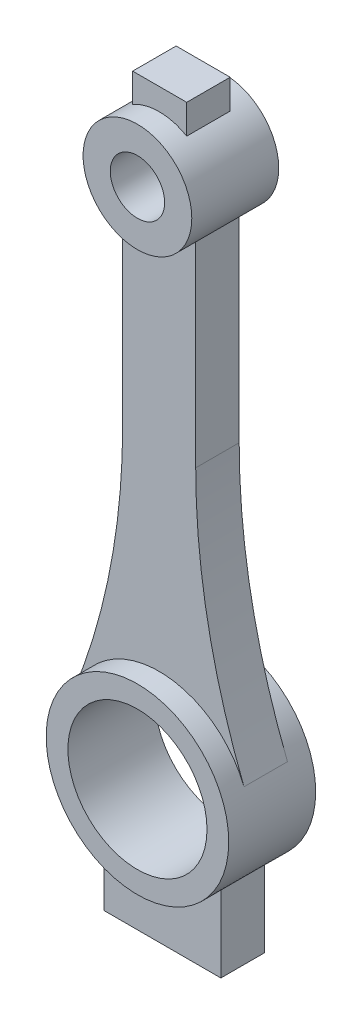
ISO-10303-21;
HEADER;
FILE_DESCRIPTION(('STEP AP214'),'2;1');
FILE_NAME('part.step','',(''),(''),'','','');
FILE_SCHEMA(('AUTOMOTIVE_DESIGN { 1 0 10303 214 1 1 1 1 }'));
ENDSEC;
DATA;
#1=APPLICATION_CONTEXT('core data for automotive mechanical design processes');
#2=APPLICATION_PROTOCOL_DEFINITION('international standard','automotive_design',2000,#1);
#3=PRODUCT_CONTEXT('',#1,'mechanical');
#4=PRODUCT('Part','Part','',(#3));
#5=PRODUCT_RELATED_PRODUCT_CATEGORY('part','',(#4));
#6=PRODUCT_DEFINITION_FORMATION('','',#4);
#7=PRODUCT_DEFINITION_CONTEXT('part definition',#1,'design');
#8=PRODUCT_DEFINITION('design','',#6,#7);
#9=PRODUCT_DEFINITION_SHAPE('','',#8);
#10=(LENGTH_UNIT() NAMED_UNIT(*) SI_UNIT(.MILLI.,.METRE.));
#11=(NAMED_UNIT(*) PLANE_ANGLE_UNIT() SI_UNIT($,.RADIAN.));
#12=(NAMED_UNIT(*) SI_UNIT($,.STERADIAN.) SOLID_ANGLE_UNIT());
#13=UNCERTAINTY_MEASURE_WITH_UNIT(LENGTH_MEASURE(1.E-05),#10,'distance_accuracy_value','');
#14=(GEOMETRIC_REPRESENTATION_CONTEXT(3) GLOBAL_UNCERTAINTY_ASSIGNED_CONTEXT((#13)) GLOBAL_UNIT_ASSIGNED_CONTEXT((#10,
#11,#12)) REPRESENTATION_CONTEXT('',''));
#15=CARTESIAN_POINT('',(0.,0.,0.));
#16=DIRECTION('',(0.,0.,1.));
#17=DIRECTION('',(1.,0.,0.));
#18=AXIS2_PLACEMENT_3D('',#15,#16,#17);
#19=CARTESIAN_POINT('',(0.,-43.8102887230163,-10.));
#20=DIRECTION('',(0.,0.,1.));
#21=DIRECTION('',(1.,0.,0.));
#22=AXIS2_PLACEMENT_3D('',#19,#20,#21);
#23=CYLINDRICAL_SURFACE('',#22,16.);
#24=CARTESIAN_POINT('',(0.,-43.8102887230163,-10.));
#25=DIRECTION('',(0.,0.,1.));
#26=DIRECTION('',(1.,0.,0.));
#27=AXIS2_PLACEMENT_3D('',#24,#25,#26);
#28=CIRCLE('',#27,16.);
#29=CARTESIAN_POINT('',(16.,-43.8102887230163,-10.));
#30=VERTEX_POINT('',#29);
#31=EDGE_CURVE('E47',#30,#30,#28,.T.);
#32=ORIENTED_EDGE('',*,*,#31,.F.);
#33=EDGE_LOOP('',(#32));
#34=FACE_BOUND('',#33,.T.);
#35=CARTESIAN_POINT('',(0.,-43.8102887230163,10.));
#36=DIRECTION('',(0.,0.,1.));
#37=DIRECTION('',(1.,0.,0.));
#38=AXIS2_PLACEMENT_3D('',#35,#36,#37);
#39=CIRCLE('',#38,16.);
#40=CARTESIAN_POINT('',(16.,-43.8102887230163,10.));
#41=VERTEX_POINT('',#40);
#42=EDGE_CURVE('E257',#41,#41,#39,.T.);
#43=ORIENTED_EDGE('',*,*,#42,.T.);
#44=EDGE_LOOP('',(#43));
#45=FACE_BOUND('',#44,.T.);
#46=ADVANCED_FACE('F39',(#34,#45),#23,.F.);
#47=CARTESIAN_POINT('',(0.,-43.8102887230163,-10.));
#48=DIRECTION('',(0.,0.,1.));
#49=DIRECTION('',(1.,0.,0.));
#50=AXIS2_PLACEMENT_3D('',#47,#48,#49);
#51=CYLINDRICAL_SURFACE('',#50,21.);
#52=CARTESIAN_POINT('',(0.,-43.8102887230163,5.));
#53=DIRECTION('',(0.,0.,1.));
#54=DIRECTION('',(1.,0.,0.));
#55=AXIS2_PLACEMENT_3D('',#52,#53,#54);
#56=CIRCLE('',#55,21.);
#57=CARTESIAN_POINT('',(-12.6446236685634,-60.5767281864327,5.));
#58=VERTEX_POINT('',#57);
#59=CARTESIAN_POINT('',(14.1852685488481,-59.2950604745488,5.));
#60=VERTEX_POINT('',#59);
#61=EDGE_CURVE('E153',#58,#60,#56,.T.);
#62=ORIENTED_EDGE('',*,*,#61,.T.);
#63=DIRECTION('',(0.,0.,-1.));
#64=VECTOR('',#63,1.);
#65=CARTESIAN_POINT('',(14.1852685488481,-59.2950604745488,5.));
#66=LINE('',#65,#64);
#67=CARTESIAN_POINT('',(14.1852685488481,-59.2950604745488,-5.));
#68=VERTEX_POINT('',#67);
#69=EDGE_CURVE('E545',#60,#68,#66,.T.);
#70=ORIENTED_EDGE('',*,*,#69,.T.);
#71=CARTESIAN_POINT('',(0.,-43.8102887230163,-5.));
#72=DIRECTION('',(0.,0.,1.));
#73=DIRECTION('',(1.,0.,0.));
#74=AXIS2_PLACEMENT_3D('',#71,#72,#73);
#75=CIRCLE('',#74,21.);
#76=CARTESIAN_POINT('',(-12.6446236685634,-60.5767281864327,-5.));
#77=VERTEX_POINT('',#76);
#78=EDGE_CURVE('E166',#77,#68,#75,.T.);
#79=ORIENTED_EDGE('',*,*,#78,.F.);
#80=DIRECTION('',(0.,0.,-1.));
#81=VECTOR('',#80,1.);
#82=CARTESIAN_POINT('',(-12.6446236685634,-60.5767281864327,5.));
#83=LINE('',#82,#81);
#84=EDGE_CURVE('E146',#58,#77,#83,.T.);
#85=ORIENTED_EDGE('',*,*,#84,.F.);
#86=EDGE_LOOP('',(#62,#70,#79,#85));
#87=FACE_BOUND('',#86,.T.);
#88=CARTESIAN_POINT('',(0.,-43.8102887230163,5.));
#89=DIRECTION('',(0.,0.,1.));
#90=DIRECTION('',(1.,0.,0.));
#91=AXIS2_PLACEMENT_3D('',#88,#89,#90);
#92=CIRCLE('',#91,21.);
#93=CARTESIAN_POINT('',(19.5123145143066,-36.04694007087,5.));
#94=VERTEX_POINT('',#93);
#95=CARTESIAN_POINT('',(-19.5123145143066,-36.04694007087,5.));
#96=VERTEX_POINT('',#95);
#97=EDGE_CURVE('E225',#94,#96,#92,.T.);
#98=ORIENTED_EDGE('',*,*,#97,.T.);
#99=DIRECTION('',(0.,0.,-1.));
#100=VECTOR('',#99,1.);
#101=CARTESIAN_POINT('',(-19.5123145143066,-36.04694007087,5.));
#102=LINE('',#101,#100);
#103=CARTESIAN_POINT('',(-19.5123145143066,-36.04694007087,-5.));
#104=VERTEX_POINT('',#103);
#105=EDGE_CURVE('E244',#96,#104,#102,.T.);
#106=ORIENTED_EDGE('',*,*,#105,.T.);
#107=CARTESIAN_POINT('',(0.,-43.8102887230163,-5.));
#108=DIRECTION('',(0.,0.,1.));
#109=DIRECTION('',(1.,0.,0.));
#110=AXIS2_PLACEMENT_3D('',#107,#108,#109);
#111=CIRCLE('',#110,21.);
#112=CARTESIAN_POINT('',(19.5123145143066,-36.04694007087,-5.));
#113=VERTEX_POINT('',#112);
#114=EDGE_CURVE('E216',#113,#104,#111,.T.);
#115=ORIENTED_EDGE('',*,*,#114,.F.);
#116=DIRECTION('',(0.,0.,-1.));
#117=VECTOR('',#116,1.);
#118=CARTESIAN_POINT('',(19.5123145143066,-36.04694007087,5.));
#119=LINE('',#118,#117);
#120=EDGE_CURVE('E228',#94,#113,#119,.T.);
#121=ORIENTED_EDGE('',*,*,#120,.F.);
#122=EDGE_LOOP('',(#98,#106,#115,#121));
#123=FACE_BOUND('',#122,.T.);
#124=CARTESIAN_POINT('',(0.,-43.8102887230163,-10.));
#125=DIRECTION('',(0.,0.,1.));
#126=DIRECTION('',(1.,0.,0.));
#127=AXIS2_PLACEMENT_3D('',#124,#125,#126);
#128=CIRCLE('',#127,21.);
#129=CARTESIAN_POINT('',(21.,-43.8102887230163,-10.));
#130=VERTEX_POINT('',#129);
#131=EDGE_CURVE('E11',#130,#130,#128,.T.);
#132=ORIENTED_EDGE('',*,*,#131,.T.);
#133=EDGE_LOOP('',(#132));
#134=FACE_BOUND('',#133,.T.);
#135=CARTESIAN_POINT('',(0.,-43.8102887230163,10.));
#136=DIRECTION('',(0.,0.,1.));
#137=DIRECTION('',(1.,0.,0.));
#138=AXIS2_PLACEMENT_3D('',#135,#136,#137);
#139=CIRCLE('',#138,21.);
#140=CARTESIAN_POINT('',(21.,-43.8102887230163,10.));
#141=VERTEX_POINT('',#140);
#142=EDGE_CURVE('E42',#141,#141,#139,.T.);
#143=ORIENTED_EDGE('',*,*,#142,.F.);
#144=EDGE_LOOP('',(#143));
#145=FACE_BOUND('',#144,.T.);
#146=ADVANCED_FACE('F164',(#87,#123,#134,#145),#51,.T.);
#147=CARTESIAN_POINT('',(0.,0.,-10.));
#148=DIRECTION('',(0.,0.,1.));
#149=DIRECTION('',(1.,0.,0.));
#150=AXIS2_PLACEMENT_3D('',#147,#148,#149);
#151=PLANE('',#150);
#152=ORIENTED_EDGE('',*,*,#31,.T.);
#153=EDGE_LOOP('',(#152));
#154=FACE_BOUND('',#153,.T.);
#155=ORIENTED_EDGE('',*,*,#131,.F.);
#156=EDGE_LOOP('',(#155));
#157=FACE_BOUND('',#156,.T.);
#158=ADVANCED_FACE('F268',(#154,#157),#151,.F.);
#159=CARTESIAN_POINT('',(0.,0.,10.));
#160=DIRECTION('',(0.,0.,1.));
#161=DIRECTION('',(1.,0.,0.));
#162=AXIS2_PLACEMENT_3D('',#159,#160,#161);
#163=PLANE('',#162);
#164=ORIENTED_EDGE('',*,*,#42,.F.);
#165=EDGE_LOOP('',(#164));
#166=FACE_BOUND('',#165,.T.);
#167=ORIENTED_EDGE('',*,*,#142,.T.);
#168=EDGE_LOOP('',(#167));
#169=FACE_BOUND('',#168,.T.);
#170=ADVANCED_FACE('F265',(#166,#169),#163,.T.);
#171=CARTESIAN_POINT('',(165.241290449792,21.9341286576959,5.));
#172=DIRECTION('',(0.,0.,-1.));
#173=DIRECTION('',(-1.,0.,0.));
#174=AXIS2_PLACEMENT_3D('',#171,#172,#173);
#175=CYLINDRICAL_SURFACE('',#174,156.839850669758);
#176=CARTESIAN_POINT('',(165.241290449792,21.9341286576959,-5.));
#177=DIRECTION('',(0.,0.,1.));
#178=DIRECTION('',(1.,0.,0.));
#179=AXIS2_PLACEMENT_3D('',#176,#177,#178);
#180=CIRCLE('',#179,156.839850669758);
#181=CARTESIAN_POINT('',(8.40143978003401,21.9341286576959,-5.));
#182=VERTEX_POINT('',#181);
#183=EDGE_CURVE('E208',#182,#113,#180,.T.);
#184=ORIENTED_EDGE('',*,*,#183,.F.);
#185=DIRECTION('',(0.,0.,-1.));
#186=VECTOR('',#185,1.);
#187=CARTESIAN_POINT('',(8.40143978003401,21.9341286576959,5.));
#188=LINE('',#187,#186);
#189=CARTESIAN_POINT('',(8.40143978003401,21.9341286576959,5.));
#190=VERTEX_POINT('',#189);
#191=EDGE_CURVE('E255',#190,#182,#188,.T.);
#192=ORIENTED_EDGE('',*,*,#191,.F.);
#193=CARTESIAN_POINT('',(165.241290449792,21.9341286576959,5.));
#194=DIRECTION('',(0.,0.,1.));
#195=DIRECTION('',(1.,0.,0.));
#196=AXIS2_PLACEMENT_3D('',#193,#194,#195);
#197=CIRCLE('',#196,156.839850669758);
#198=EDGE_CURVE('E213',#190,#94,#197,.T.);
#199=ORIENTED_EDGE('',*,*,#198,.T.);
#200=ORIENTED_EDGE('',*,*,#120,.T.);
#201=EDGE_LOOP('',(#184,#192,#199,#200));
#202=FACE_BOUND('',#201,.T.);
#203=ADVANCED_FACE('F278',(#202),#175,.F.);
#204=CARTESIAN_POINT('',(8.401439780034,0.,5.));
#205=DIRECTION('',(1.,0.,0.));
#206=DIRECTION('',(0.,1.,0.));
#207=AXIS2_PLACEMENT_3D('',#204,#205,#206);
#208=PLANE('',#207);
#209=DIRECTION('',(0.,-1.,0.));
#210=VECTOR('',#209,1.);
#211=CARTESIAN_POINT('',(8.401439780034,0.,-5.));
#212=LINE('',#211,#210);
#213=CARTESIAN_POINT('',(8.40143978003401,66.9341286576959,-5.));
#214=VERTEX_POINT('',#213);
#215=EDGE_CURVE('E230',#214,#182,#212,.T.);
#216=ORIENTED_EDGE('',*,*,#215,.F.);
#217=DIRECTION('',(0.,0.,-1.));
#218=VECTOR('',#217,1.);
#219=CARTESIAN_POINT('',(8.40143978003401,66.9341286576959,5.));
#220=LINE('',#219,#218);
#221=CARTESIAN_POINT('',(8.40143978003401,66.934128657696,5.));
#222=VERTEX_POINT('',#221);
#223=EDGE_CURVE('E253',#222,#214,#220,.T.);
#224=ORIENTED_EDGE('',*,*,#223,.F.);
#225=DIRECTION('',(0.,-1.,0.));
#226=VECTOR('',#225,1.);
#227=CARTESIAN_POINT('',(8.401439780034,0.,5.));
#228=LINE('',#227,#226);
#229=EDGE_CURVE('E215',#222,#190,#228,.T.);
#230=ORIENTED_EDGE('',*,*,#229,.T.);
#231=ORIENTED_EDGE('',*,*,#191,.T.);
#232=EDGE_LOOP('',(#216,#224,#230,#231));
#233=FACE_BOUND('',#232,.T.);
#234=ADVANCED_FACE('F283',(#233),#208,.T.);
#235=CARTESIAN_POINT('',(-8.401439780034,0.,5.));
#236=DIRECTION('',(1.,0.,0.));
#237=DIRECTION('',(0.,1.,0.));
#238=AXIS2_PLACEMENT_3D('',#235,#236,#237);
#239=PLANE('',#238);
#240=DIRECTION('',(0.,-1.,0.));
#241=VECTOR('',#240,1.);
#242=CARTESIAN_POINT('',(-8.401439780034,0.,-5.));
#243=LINE('',#242,#241);
#244=CARTESIAN_POINT('',(-8.40143978003401,66.934128657696,-5.));
#245=VERTEX_POINT('',#244);
#246=CARTESIAN_POINT('',(-8.40143978003401,21.9341286576959,-5.));
#247=VERTEX_POINT('',#246);
#248=EDGE_CURVE('E236',#245,#247,#243,.T.);
#249=ORIENTED_EDGE('',*,*,#248,.T.);
#250=DIRECTION('',(0.,0.,-1.));
#251=VECTOR('',#250,1.);
#252=CARTESIAN_POINT('',(-8.40143978003401,21.9341286576959,5.));
#253=LINE('',#252,#251);
#254=CARTESIAN_POINT('',(-8.40143978003401,21.9341286576959,5.));
#255=VERTEX_POINT('',#254);
#256=EDGE_CURVE('E247',#255,#247,#253,.T.);
#257=ORIENTED_EDGE('',*,*,#256,.F.);
#258=DIRECTION('',(0.,-1.,0.));
#259=VECTOR('',#258,1.);
#260=CARTESIAN_POINT('',(-8.401439780034,0.,5.));
#261=LINE('',#260,#259);
#262=CARTESIAN_POINT('',(-8.40143978003401,66.934128657696,5.));
#263=VERTEX_POINT('',#262);
#264=EDGE_CURVE('E221',#263,#255,#261,.T.);
#265=ORIENTED_EDGE('',*,*,#264,.F.);
#266=DIRECTION('',(0.,0.,-1.));
#267=VECTOR('',#266,1.);
#268=CARTESIAN_POINT('',(-8.40143978003401,66.9341286576959,5.));
#269=LINE('',#268,#267);
#270=EDGE_CURVE('E250',#263,#245,#269,.T.);
#271=ORIENTED_EDGE('',*,*,#270,.T.);
#272=EDGE_LOOP('',(#249,#257,#265,#271));
#273=FACE_BOUND('',#272,.T.);
#274=ADVANCED_FACE('F287',(#273),#239,.F.);
#275=CARTESIAN_POINT('',(-165.241290449792,21.9341286576959,5.));
#276=DIRECTION('',(0.,0.,-1.));
#277=DIRECTION('',(-1.,0.,0.));
#278=AXIS2_PLACEMENT_3D('',#275,#276,#277);
#279=CYLINDRICAL_SURFACE('',#278,156.839850669758);
#280=CARTESIAN_POINT('',(-165.241290449792,21.9341286576959,-5.));
#281=DIRECTION('',(0.,0.,1.));
#282=DIRECTION('',(1.,0.,0.));
#283=AXIS2_PLACEMENT_3D('',#280,#281,#282);
#284=CIRCLE('',#283,156.839850669758);
#285=EDGE_CURVE('E238',#247,#104,#284,.F.);
#286=ORIENTED_EDGE('',*,*,#285,.T.);
#287=ORIENTED_EDGE('',*,*,#105,.F.);
#288=CARTESIAN_POINT('',(-165.241290449792,21.9341286576959,5.));
#289=DIRECTION('',(0.,0.,1.));
#290=DIRECTION('',(1.,0.,0.));
#291=AXIS2_PLACEMENT_3D('',#288,#289,#290);
#292=CIRCLE('',#291,156.839850669758);
#293=EDGE_CURVE('E223',#255,#96,#292,.F.);
#294=ORIENTED_EDGE('',*,*,#293,.F.);
#295=ORIENTED_EDGE('',*,*,#256,.T.);
#296=EDGE_LOOP('',(#286,#287,#294,#295));
#297=FACE_BOUND('',#296,.T.);
#298=ADVANCED_FACE('F291',(#297),#279,.F.);
#299=CARTESIAN_POINT('',(0.,0.,5.));
#300=DIRECTION('',(0.,0.,1.));
#301=DIRECTION('',(1.,0.,0.));
#302=AXIS2_PLACEMENT_3D('',#299,#300,#301);
#303=PLANE('',#302);
#304=ORIENTED_EDGE('',*,*,#198,.F.);
#305=ORIENTED_EDGE('',*,*,#229,.F.);
#306=CARTESIAN_POINT('',(0.,76.1897112769837,5.));
#307=DIRECTION('',(0.,0.,1.));
#308=DIRECTION('',(1.,0.,0.));
#309=AXIS2_PLACEMENT_3D('',#306,#307,#308);
#310=CIRCLE('',#309,12.5);
#311=EDGE_CURVE('E219',#263,#222,#310,.T.);
#312=ORIENTED_EDGE('',*,*,#311,.F.);
#313=ORIENTED_EDGE('',*,*,#264,.T.);
#314=ORIENTED_EDGE('',*,*,#293,.T.);
#315=ORIENTED_EDGE('',*,*,#97,.F.);
#316=EDGE_LOOP('',(#304,#305,#312,#313,#314,#315));
#317=FACE_BOUND('',#316,.T.);
#318=ADVANCED_FACE('F295',(#317),#303,.T.);
#319=CARTESIAN_POINT('',(0.,0.,-5.));
#320=DIRECTION('',(0.,0.,1.));
#321=DIRECTION('',(1.,0.,0.));
#322=AXIS2_PLACEMENT_3D('',#319,#320,#321);
#323=PLANE('',#322);
#324=ORIENTED_EDGE('',*,*,#183,.T.);
#325=ORIENTED_EDGE('',*,*,#114,.T.);
#326=ORIENTED_EDGE('',*,*,#285,.F.);
#327=ORIENTED_EDGE('',*,*,#248,.F.);
#328=CARTESIAN_POINT('',(0.,76.1897112769837,-5.));
#329=DIRECTION('',(0.,0.,1.));
#330=DIRECTION('',(1.,0.,0.));
#331=AXIS2_PLACEMENT_3D('',#328,#329,#330);
#332=CIRCLE('',#331,12.5);
#333=EDGE_CURVE('E233',#245,#214,#332,.T.);
#334=ORIENTED_EDGE('',*,*,#333,.T.);
#335=ORIENTED_EDGE('',*,*,#215,.T.);
#336=EDGE_LOOP('',(#324,#325,#326,#327,#334,#335));
#337=FACE_BOUND('',#336,.T.);
#338=ADVANCED_FACE('F297',(#337),#323,.F.);
#339=CARTESIAN_POINT('',(0.,76.1897112769837,-10.));
#340=DIRECTION('',(0.,0.,1.));
#341=DIRECTION('',(1.,0.,0.));
#342=AXIS2_PLACEMENT_3D('',#339,#340,#341);
#343=CYLINDRICAL_SURFACE('',#342,6.25000000000001);
#344=CARTESIAN_POINT('',(0.,76.1897112769837,-10.));
#345=DIRECTION('',(0.,0.,1.));
#346=DIRECTION('',(1.,0.,0.));
#347=AXIS2_PLACEMENT_3D('',#344,#345,#346);
#348=CIRCLE('',#347,6.25000000000001);
#349=CARTESIAN_POINT('',(6.25000000000001,76.1897112769837,-10.));
#350=VERTEX_POINT('',#349);
#351=EDGE_CURVE('E201',#350,#350,#348,.T.);
#352=ORIENTED_EDGE('',*,*,#351,.F.);
#353=EDGE_LOOP('',(#352));
#354=FACE_BOUND('',#353,.T.);
#355=CARTESIAN_POINT('',(0.,76.1897112769837,10.));
#356=DIRECTION('',(0.,0.,1.));
#357=DIRECTION('',(1.,0.,0.));
#358=AXIS2_PLACEMENT_3D('',#355,#356,#357);
#359=CIRCLE('',#358,6.25000000000001);
#360=CARTESIAN_POINT('',(6.25000000000001,76.1897112769837,10.));
#361=VERTEX_POINT('',#360);
#362=EDGE_CURVE('E200',#361,#361,#359,.T.);
#363=ORIENTED_EDGE('',*,*,#362,.T.);
#364=EDGE_LOOP('',(#363));
#365=FACE_BOUND('',#364,.T.);
#366=ADVANCED_FACE('F300',(#354,#365),#343,.F.);
#367=CARTESIAN_POINT('',(0.,76.1897112769837,-10.));
#368=DIRECTION('',(0.,0.,1.));
#369=DIRECTION('',(1.,0.,0.));
#370=AXIS2_PLACEMENT_3D('',#367,#368,#369);
#371=CYLINDRICAL_SURFACE('',#370,12.5);
#372=CARTESIAN_POINT('',(0.,76.1897112769837,5.));
#373=DIRECTION('',(0.,0.,1.));
#374=DIRECTION('',(1.,0.,0.));
#375=AXIS2_PLACEMENT_3D('',#372,#373,#374);
#376=CIRCLE('',#375,12.5);
#377=CARTESIAN_POINT('',(6.33069124529355,86.9680389931354,5.));
#378=VERTEX_POINT('',#377);
#379=CARTESIAN_POINT('',(-6.10309836999412,87.0985237827597,5.));
#380=VERTEX_POINT('',#379);
#381=EDGE_CURVE('E174',#378,#380,#376,.T.);
#382=ORIENTED_EDGE('',*,*,#381,.T.);
#383=DIRECTION('',(0.,0.,-1.));
#384=VECTOR('',#383,1.);
#385=CARTESIAN_POINT('',(-6.10309836999412,87.0985237827597,5.));
#386=LINE('',#385,#384);
#387=CARTESIAN_POINT('',(-6.10309836999412,87.0985237827597,-5.));
#388=VERTEX_POINT('',#387);
#389=EDGE_CURVE('E185',#380,#388,#386,.T.);
#390=ORIENTED_EDGE('',*,*,#389,.T.);
#391=CARTESIAN_POINT('',(0.,76.1897112769837,-5.));
#392=DIRECTION('',(0.,0.,1.));
#393=DIRECTION('',(1.,0.,0.));
#394=AXIS2_PLACEMENT_3D('',#391,#392,#393);
#395=CIRCLE('',#394,12.5);
#396=CARTESIAN_POINT('',(6.33069124529355,86.9680389931354,-5.));
#397=VERTEX_POINT('',#396);
#398=EDGE_CURVE('E167',#397,#388,#395,.T.);
#399=ORIENTED_EDGE('',*,*,#398,.F.);
#400=DIRECTION('',(0.,0.,-1.));
#401=VECTOR('',#400,1.);
#402=CARTESIAN_POINT('',(6.33069124529355,86.9680389931354,5.));
#403=LINE('',#402,#401);
#404=EDGE_CURVE('E198',#378,#397,#403,.T.);
#405=ORIENTED_EDGE('',*,*,#404,.F.);
#406=EDGE_LOOP('',(#382,#390,#399,#405));
#407=FACE_BOUND('',#406,.T.);
#408=ORIENTED_EDGE('',*,*,#270,.F.);
#409=ORIENTED_EDGE('',*,*,#311,.T.);
#410=ORIENTED_EDGE('',*,*,#223,.T.);
#411=ORIENTED_EDGE('',*,*,#333,.F.);
#412=EDGE_LOOP('',(#408,#409,#410,#411));
#413=FACE_BOUND('',#412,.T.);
#414=CARTESIAN_POINT('',(0.,76.1897112769837,-10.));
#415=DIRECTION('',(0.,0.,1.));
#416=DIRECTION('',(1.,0.,0.));
#417=AXIS2_PLACEMENT_3D('',#414,#415,#416);
#418=CIRCLE('',#417,12.5);
#419=CARTESIAN_POINT('',(12.5,76.1897112769837,-10.));
#420=VERTEX_POINT('',#419);
#421=EDGE_CURVE('E204',#420,#420,#418,.T.);
#422=ORIENTED_EDGE('',*,*,#421,.T.);
#423=EDGE_LOOP('',(#422));
#424=FACE_BOUND('',#423,.T.);
#425=CARTESIAN_POINT('',(0.,76.1897112769837,10.));
#426=DIRECTION('',(0.,0.,1.));
#427=DIRECTION('',(1.,0.,0.));
#428=AXIS2_PLACEMENT_3D('',#425,#426,#427);
#429=CIRCLE('',#428,12.5);
#430=CARTESIAN_POINT('',(12.5,76.1897112769837,10.));
#431=VERTEX_POINT('',#430);
#432=EDGE_CURVE('E205',#431,#431,#429,.T.);
#433=ORIENTED_EDGE('',*,*,#432,.F.);
#434=EDGE_LOOP('',(#433));
#435=FACE_BOUND('',#434,.T.);
#436=ADVANCED_FACE('F307',(#407,#413,#424,#435),#371,.T.);
#437=CARTESIAN_POINT('',(0.,0.,-10.));
#438=DIRECTION('',(0.,0.,1.));
#439=DIRECTION('',(1.,0.,0.));
#440=AXIS2_PLACEMENT_3D('',#437,#438,#439);
#441=PLANE('',#440);
#442=ORIENTED_EDGE('',*,*,#351,.T.);
#443=EDGE_LOOP('',(#442));
#444=FACE_BOUND('',#443,.T.);
#445=ORIENTED_EDGE('',*,*,#421,.F.);
#446=EDGE_LOOP('',(#445));
#447=FACE_BOUND('',#446,.T.);
#448=ADVANCED_FACE('F311',(#444,#447),#441,.F.);
#449=CARTESIAN_POINT('',(0.,0.,10.));
#450=DIRECTION('',(0.,0.,1.));
#451=DIRECTION('',(1.,0.,0.));
#452=AXIS2_PLACEMENT_3D('',#449,#450,#451);
#453=PLANE('',#452);
#454=ORIENTED_EDGE('',*,*,#362,.F.);
#455=EDGE_LOOP('',(#454));
#456=FACE_BOUND('',#455,.T.);
#457=ORIENTED_EDGE('',*,*,#432,.T.);
#458=EDGE_LOOP('',(#457));
#459=FACE_BOUND('',#458,.T.);
#460=ADVANCED_FACE('F313',(#456,#459),#453,.T.);
#461=CARTESIAN_POINT('',(6.33069124529355,0.,5.));
#462=DIRECTION('',(-1.,0.,0.));
#463=DIRECTION('',(0.,0.,1.));
#464=AXIS2_PLACEMENT_3D('',#461,#462,#463);
#465=PLANE('',#464);
#466=DIRECTION('',(0.,1.,0.));
#467=VECTOR('',#466,1.);
#468=CARTESIAN_POINT('',(6.33069124529355,0.,-5.));
#469=LINE('',#468,#467);
#470=CARTESIAN_POINT('',(6.33069124529355,93.7148240332734,-5.));
#471=VERTEX_POINT('',#470);
#472=EDGE_CURVE('E63',#397,#471,#469,.T.);
#473=ORIENTED_EDGE('',*,*,#472,.T.);
#474=DIRECTION('',(0.,0.,-1.));
#475=VECTOR('',#474,1.);
#476=CARTESIAN_POINT('',(6.33069124529355,93.7148240332734,5.));
#477=LINE('',#476,#475);
#478=CARTESIAN_POINT('',(6.33069124529355,93.7148240332734,5.));
#479=VERTEX_POINT('',#478);
#480=EDGE_CURVE('E196',#479,#471,#477,.T.);
#481=ORIENTED_EDGE('',*,*,#480,.F.);
#482=DIRECTION('',(0.,1.,0.));
#483=VECTOR('',#482,1.);
#484=CARTESIAN_POINT('',(6.33069124529355,0.,5.));
#485=LINE('',#484,#483);
#486=EDGE_CURVE('E177',#378,#479,#485,.T.);
#487=ORIENTED_EDGE('',*,*,#486,.F.);
#488=ORIENTED_EDGE('',*,*,#404,.T.);
#489=EDGE_LOOP('',(#473,#481,#487,#488));
#490=FACE_BOUND('',#489,.T.);
#491=ADVANCED_FACE('F316',(#490),#465,.F.);
#492=CARTESIAN_POINT('',(0.,93.7148240332734,5.));
#493=DIRECTION('',(0.,1.,0.));
#494=DIRECTION('',(0.,0.,1.));
#495=AXIS2_PLACEMENT_3D('',#492,#493,#494);
#496=PLANE('',#495);
#497=DIRECTION('',(1.,0.,0.));
#498=VECTOR('',#497,1.);
#499=CARTESIAN_POINT('',(0.,93.7148240332734,-5.));
#500=LINE('',#499,#498);
#501=CARTESIAN_POINT('',(-6.10309836999412,93.7148240332734,-5.));
#502=VERTEX_POINT('',#501);
#503=EDGE_CURVE('E188',#502,#471,#500,.T.);
#504=ORIENTED_EDGE('',*,*,#503,.F.);
#505=DIRECTION('',(0.,0.,-1.));
#506=VECTOR('',#505,1.);
#507=CARTESIAN_POINT('',(-6.10309836999412,93.7148240332734,5.));
#508=LINE('',#507,#506);
#509=CARTESIAN_POINT('',(-6.10309836999412,93.7148240332734,5.));
#510=VERTEX_POINT('',#509);
#511=EDGE_CURVE('E194',#510,#502,#508,.T.);
#512=ORIENTED_EDGE('',*,*,#511,.F.);
#513=DIRECTION('',(1.,0.,0.));
#514=VECTOR('',#513,1.);
#515=CARTESIAN_POINT('',(0.,93.7148240332734,5.));
#516=LINE('',#515,#514);
#517=EDGE_CURVE('E180',#510,#479,#516,.T.);
#518=ORIENTED_EDGE('',*,*,#517,.T.);
#519=ORIENTED_EDGE('',*,*,#480,.T.);
#520=EDGE_LOOP('',(#504,#512,#518,#519));
#521=FACE_BOUND('',#520,.T.);
#522=ADVANCED_FACE('F323',(#521),#496,.T.);
#523=CARTESIAN_POINT('',(-6.10309836999412,0.,5.));
#524=DIRECTION('',(-1.,0.,0.));
#525=DIRECTION('',(0.,0.,1.));
#526=AXIS2_PLACEMENT_3D('',#523,#524,#525);
#527=PLANE('',#526);
#528=DIRECTION('',(0.,1.,0.));
#529=VECTOR('',#528,1.);
#530=CARTESIAN_POINT('',(-6.10309836999412,0.,-5.));
#531=LINE('',#530,#529);
#532=EDGE_CURVE('E178',#388,#502,#531,.T.);
#533=ORIENTED_EDGE('',*,*,#532,.F.);
#534=ORIENTED_EDGE('',*,*,#389,.F.);
#535=DIRECTION('',(0.,1.,0.));
#536=VECTOR('',#535,1.);
#537=CARTESIAN_POINT('',(-6.10309836999412,0.,5.));
#538=LINE('',#537,#536);
#539=EDGE_CURVE('E183',#380,#510,#538,.T.);
#540=ORIENTED_EDGE('',*,*,#539,.T.);
#541=ORIENTED_EDGE('',*,*,#511,.T.);
#542=EDGE_LOOP('',(#533,#534,#540,#541));
#543=FACE_BOUND('',#542,.T.);
#544=ADVANCED_FACE('F327',(#543),#527,.T.);
#545=CARTESIAN_POINT('',(0.,0.,5.));
#546=DIRECTION('',(0.,0.,1.));
#547=DIRECTION('',(1.,0.,0.));
#548=AXIS2_PLACEMENT_3D('',#545,#546,#547);
#549=PLANE('',#548);
#550=ORIENTED_EDGE('',*,*,#381,.F.);
#551=ORIENTED_EDGE('',*,*,#486,.T.);
#552=ORIENTED_EDGE('',*,*,#517,.F.);
#553=ORIENTED_EDGE('',*,*,#539,.F.);
#554=EDGE_LOOP('',(#550,#551,#552,#553));
#555=FACE_BOUND('',#554,.T.);
#556=ADVANCED_FACE('F331',(#555),#549,.T.);
#557=CARTESIAN_POINT('',(0.,0.,-5.));
#558=DIRECTION('',(0.,0.,1.));
#559=DIRECTION('',(1.,0.,0.));
#560=AXIS2_PLACEMENT_3D('',#557,#558,#559);
#561=PLANE('',#560);
#562=ORIENTED_EDGE('',*,*,#398,.T.);
#563=ORIENTED_EDGE('',*,*,#532,.T.);
#564=ORIENTED_EDGE('',*,*,#503,.T.);
#565=ORIENTED_EDGE('',*,*,#472,.F.);
#566=EDGE_LOOP('',(#562,#563,#564,#565));
#567=FACE_BOUND('',#566,.T.);
#568=ADVANCED_FACE('F333',(#567),#561,.F.);
#569=CARTESIAN_POINT('',(-12.6446236685634,0.,5.));
#570=DIRECTION('',(1.,0.,0.));
#571=DIRECTION('',(0.,1.,0.));
#572=AXIS2_PLACEMENT_3D('',#569,#570,#571);
#573=PLANE('',#572);
#574=DIRECTION('',(0.,-1.,0.));
#575=VECTOR('',#574,1.);
#576=CARTESIAN_POINT('',(-12.6446236685634,0.,-5.));
#577=LINE('',#576,#575);
#578=CARTESIAN_POINT('',(-12.6446236685633,-76.8053958188232,-5.));
#579=VERTEX_POINT('',#578);
#580=EDGE_CURVE('E55',#77,#579,#577,.T.);
#581=ORIENTED_EDGE('',*,*,#580,.T.);
#582=DIRECTION('',(0.,0.,-1.));
#583=VECTOR('',#582,1.);
#584=CARTESIAN_POINT('',(-12.6446236685633,-76.8053958188232,5.));
#585=LINE('',#584,#583);
#586=CARTESIAN_POINT('',(-12.6446236685633,-76.8053958188232,5.));
#587=VERTEX_POINT('',#586);
#588=EDGE_CURVE('E149',#587,#579,#585,.T.);
#589=ORIENTED_EDGE('',*,*,#588,.F.);
#590=DIRECTION('',(0.,-1.,0.));
#591=VECTOR('',#590,1.);
#592=CARTESIAN_POINT('',(-12.6446236685634,0.,5.));
#593=LINE('',#592,#591);
#594=EDGE_CURVE('E142',#58,#587,#593,.T.);
#595=ORIENTED_EDGE('',*,*,#594,.F.);
#596=ORIENTED_EDGE('',*,*,#84,.T.);
#597=EDGE_LOOP('',(#581,#589,#595,#596));
#598=FACE_BOUND('',#597,.T.);
#599=ADVANCED_FACE('F144',(#598),#573,.F.);
#600=CARTESIAN_POINT('',(0.,-76.8053958188232,5.));
#601=DIRECTION('',(0.,1.,0.));
#602=DIRECTION('',(0.,0.,1.));
#603=AXIS2_PLACEMENT_3D('',#600,#601,#602);
#604=PLANE('',#603);
#605=DIRECTION('',(1.,0.,0.));
#606=VECTOR('',#605,1.);
#607=CARTESIAN_POINT('',(0.,-76.8053958188232,-5.));
#608=LINE('',#607,#606);
#609=CARTESIAN_POINT('',(14.1852685488481,-76.8053958188232,-5.));
#610=VERTEX_POINT('',#609);
#611=EDGE_CURVE('E551',#579,#610,#608,.T.);
#612=ORIENTED_EDGE('',*,*,#611,.T.);
#613=DIRECTION('',(0.,0.,-1.));
#614=VECTOR('',#613,1.);
#615=CARTESIAN_POINT('',(14.1852685488481,-76.8053958188232,5.));
#616=LINE('',#615,#614);
#617=CARTESIAN_POINT('',(14.1852685488481,-76.8053958188232,5.));
#618=VERTEX_POINT('',#617);
#619=EDGE_CURVE('E170',#618,#610,#616,.T.);
#620=ORIENTED_EDGE('',*,*,#619,.F.);
#621=DIRECTION('',(1.,0.,0.));
#622=VECTOR('',#621,1.);
#623=CARTESIAN_POINT('',(0.,-76.8053958188232,5.));
#624=LINE('',#623,#622);
#625=EDGE_CURVE('E152',#587,#618,#624,.T.);
#626=ORIENTED_EDGE('',*,*,#625,.F.);
#627=ORIENTED_EDGE('',*,*,#588,.T.);
#628=EDGE_LOOP('',(#612,#620,#626,#627));
#629=FACE_BOUND('',#628,.T.);
#630=ADVANCED_FACE('F341',(#629),#604,.F.);
#631=CARTESIAN_POINT('',(14.1852685488481,0.,5.));
#632=DIRECTION('',(-1.,0.,0.));
#633=DIRECTION('',(0.,0.,1.));
#634=AXIS2_PLACEMENT_3D('',#631,#632,#633);
#635=PLANE('',#634);
#636=DIRECTION('',(0.,1.,0.));
#637=VECTOR('',#636,1.);
#638=CARTESIAN_POINT('',(14.1852685488481,0.,-5.));
#639=LINE('',#638,#637);
#640=EDGE_CURVE('E162',#610,#68,#639,.T.);
#641=ORIENTED_EDGE('',*,*,#640,.T.);
#642=ORIENTED_EDGE('',*,*,#69,.F.);
#643=DIRECTION('',(0.,1.,0.));
#644=VECTOR('',#643,1.);
#645=CARTESIAN_POINT('',(14.1852685488481,0.,5.));
#646=LINE('',#645,#644);
#647=EDGE_CURVE('E158',#618,#60,#646,.T.);
#648=ORIENTED_EDGE('',*,*,#647,.F.);
#649=ORIENTED_EDGE('',*,*,#619,.T.);
#650=EDGE_LOOP('',(#641,#642,#648,#649));
#651=FACE_BOUND('',#650,.T.);
#652=ADVANCED_FACE('F344',(#651),#635,.F.);
#653=CARTESIAN_POINT('',(0.,0.,5.));
#654=DIRECTION('',(0.,0.,1.));
#655=DIRECTION('',(1.,0.,0.));
#656=AXIS2_PLACEMENT_3D('',#653,#654,#655);
#657=PLANE('',#656);
#658=ORIENTED_EDGE('',*,*,#61,.F.);
#659=ORIENTED_EDGE('',*,*,#594,.T.);
#660=ORIENTED_EDGE('',*,*,#625,.T.);
#661=ORIENTED_EDGE('',*,*,#647,.T.);
#662=EDGE_LOOP('',(#658,#659,#660,#661));
#663=FACE_BOUND('',#662,.T.);
#664=ADVANCED_FACE('F156',(#663),#657,.T.);
#665=CARTESIAN_POINT('',(0.,0.,-5.));
#666=DIRECTION('',(0.,0.,1.));
#667=DIRECTION('',(1.,0.,0.));
#668=AXIS2_PLACEMENT_3D('',#665,#666,#667);
#669=PLANE('',#668);
#670=ORIENTED_EDGE('',*,*,#78,.T.);
#671=ORIENTED_EDGE('',*,*,#640,.F.);
#672=ORIENTED_EDGE('',*,*,#611,.F.);
#673=ORIENTED_EDGE('',*,*,#580,.F.);
#674=EDGE_LOOP('',(#670,#671,#672,#673));
#675=FACE_BOUND('',#674,.T.);
#676=ADVANCED_FACE('F349',(#675),#669,.F.);
#677=CLOSED_SHELL('',(#46,#146,#158,#170,#203,#234,#274,#298,#318,#338,#366,#436,#448,#460,#491,
#522,#544,#556,#568,#599,#630,#652,#664,#676));
#678=MANIFOLD_SOLID_BREP('B2',#677);
#679=ADVANCED_BREP_SHAPE_REPRESENTATION('',(#18,#678),#14);
#680=SHAPE_DEFINITION_REPRESENTATION(#9,#679);
ENDSEC;
END-ISO-10303-21;
